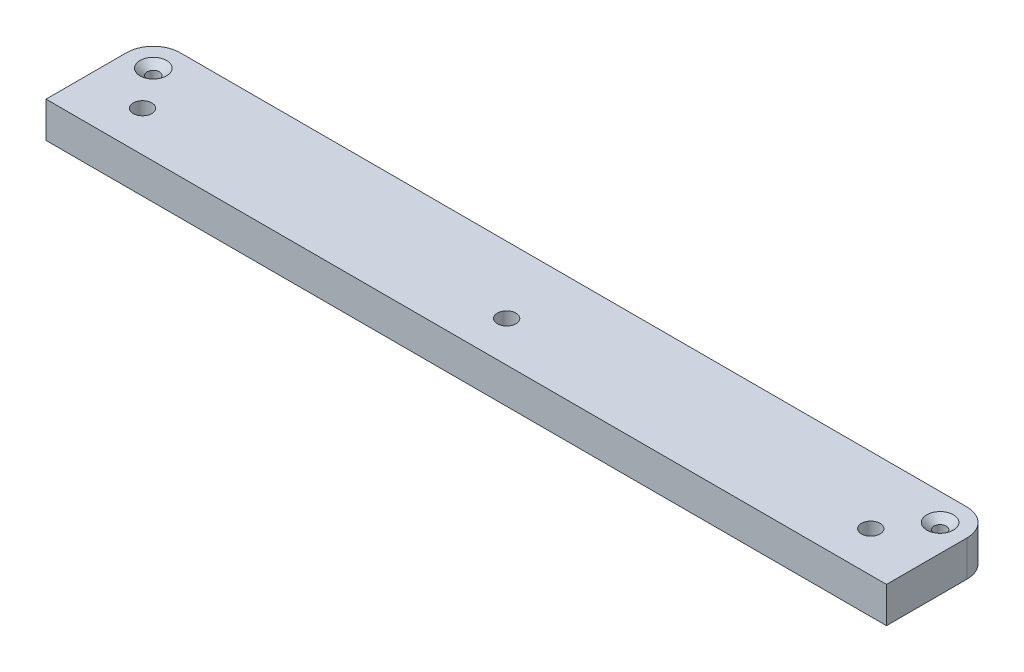
ISO-10303-21;
HEADER;
FILE_DESCRIPTION(('STEP AP214'),'2;1');
FILE_NAME('part.step','',(''),(''),'','','');
FILE_SCHEMA(('AUTOMOTIVE_DESIGN { 1 0 10303 214 1 1 1 1 }'));
ENDSEC;
DATA;
#1=APPLICATION_CONTEXT('core data for automotive mechanical design processes');
#2=APPLICATION_PROTOCOL_DEFINITION('international standard','automotive_design',2000,#1);
#3=PRODUCT_CONTEXT('',#1,'mechanical');
#4=PRODUCT('Part','Part','',(#3));
#5=PRODUCT_RELATED_PRODUCT_CATEGORY('part','',(#4));
#6=PRODUCT_DEFINITION_FORMATION('','',#4);
#7=PRODUCT_DEFINITION_CONTEXT('part definition',#1,'design');
#8=PRODUCT_DEFINITION('design','',#6,#7);
#9=PRODUCT_DEFINITION_SHAPE('','',#8);
#10=(LENGTH_UNIT() NAMED_UNIT(*) SI_UNIT(.MILLI.,.METRE.));
#11=(NAMED_UNIT(*) PLANE_ANGLE_UNIT() SI_UNIT($,.RADIAN.));
#12=(NAMED_UNIT(*) SI_UNIT($,.STERADIAN.) SOLID_ANGLE_UNIT());
#13=UNCERTAINTY_MEASURE_WITH_UNIT(LENGTH_MEASURE(1.E-05),#10,'distance_accuracy_value','');
#14=(GEOMETRIC_REPRESENTATION_CONTEXT(3) GLOBAL_UNCERTAINTY_ASSIGNED_CONTEXT((#13)) GLOBAL_UNIT_ASSIGNED_CONTEXT((#10,
#11,#12)) REPRESENTATION_CONTEXT('',''));
#15=CARTESIAN_POINT('',(0.,0.,0.));
#16=DIRECTION('',(0.,0.,1.));
#17=DIRECTION('',(1.,0.,0.));
#18=AXIS2_PLACEMENT_3D('',#15,#16,#17);
#19=CARTESIAN_POINT('',(278.511,12.7,-14.351));
#20=DIRECTION('',(0.,-1.,0.));
#21=DIRECTION('',(0.,0.,-1.));
#22=AXIS2_PLACEMENT_3D('',#19,#20,#21);
#23=CYLINDRICAL_SURFACE('',#22,1.42239999999999);
#24=CARTESIAN_POINT('',(278.511,4.7625,-14.351));
#25=DIRECTION('',(0.,1.,0.));
#26=DIRECTION('',(0.,0.,1.));
#27=AXIS2_PLACEMENT_3D('',#24,#25,#26);
#28=CIRCLE('',#27,1.42239999999999);
#29=CARTESIAN_POINT('',(278.511,4.7625,-12.9286));
#30=VERTEX_POINT('',#29);
#31=EDGE_CURVE('E137',#30,#30,#28,.T.);
#32=ORIENTED_EDGE('',*,*,#31,.T.);
#33=EDGE_LOOP('',(#32));
#34=FACE_BOUND('',#33,.T.);
#35=CARTESIAN_POINT('',(278.511,2.921,-14.351));
#36=DIRECTION('',(0.,-1.,0.));
#37=DIRECTION('',(0.,0.,-1.));
#38=AXIS2_PLACEMENT_3D('',#35,#36,#37);
#39=CIRCLE('',#38,1.42239999999999);
#40=CARTESIAN_POINT('',(278.511,2.921,-15.7734));
#41=VERTEX_POINT('',#40);
#42=EDGE_CURVE('E149',#41,#41,#39,.F.);
#43=ORIENTED_EDGE('',*,*,#42,.F.);
#44=EDGE_LOOP('',(#43));
#45=FACE_BOUND('',#44,.T.);
#46=ADVANCED_FACE('F33',(#34,#45),#23,.F.);
#47=CARTESIAN_POINT('',(149.225,12.7,-14.351));
#48=DIRECTION('',(0.,-1.,0.));
#49=DIRECTION('',(0.,0.,-1.));
#50=AXIS2_PLACEMENT_3D('',#47,#48,#49);
#51=CYLINDRICAL_SURFACE('',#50,1.42239999999999);
#52=CARTESIAN_POINT('',(149.225,4.7625,-14.351));
#53=DIRECTION('',(0.,1.,0.));
#54=DIRECTION('',(0.,0.,1.));
#55=AXIS2_PLACEMENT_3D('',#52,#53,#54);
#56=CIRCLE('',#55,1.42239999999999);
#57=CARTESIAN_POINT('',(149.225,4.7625,-12.9286));
#58=VERTEX_POINT('',#57);
#59=EDGE_CURVE('E134',#58,#58,#56,.T.);
#60=ORIENTED_EDGE('',*,*,#59,.T.);
#61=EDGE_LOOP('',(#60));
#62=FACE_BOUND('',#61,.T.);
#63=CARTESIAN_POINT('',(149.225,2.921,-14.351));
#64=DIRECTION('',(0.,-1.,0.));
#65=DIRECTION('',(0.,0.,-1.));
#66=AXIS2_PLACEMENT_3D('',#63,#64,#65);
#67=CIRCLE('',#66,1.42239999999999);
#68=CARTESIAN_POINT('',(149.225,2.921,-15.7734));
#69=VERTEX_POINT('',#68);
#70=EDGE_CURVE('E144',#69,#69,#67,.F.);
#71=ORIENTED_EDGE('',*,*,#70,.F.);
#72=EDGE_LOOP('',(#71));
#73=FACE_BOUND('',#72,.T.);
#74=ADVANCED_FACE('F249',(#62,#73),#51,.F.);
#75=CARTESIAN_POINT('',(19.939,12.7,-14.351));
#76=DIRECTION('',(0.,-1.,0.));
#77=DIRECTION('',(0.,0.,-1.));
#78=AXIS2_PLACEMENT_3D('',#75,#76,#77);
#79=CYLINDRICAL_SURFACE('',#78,1.4224);
#80=CARTESIAN_POINT('',(19.939,4.7625,-14.351));
#81=DIRECTION('',(0.,1.,0.));
#82=DIRECTION('',(0.,0.,1.));
#83=AXIS2_PLACEMENT_3D('',#80,#81,#82);
#84=CIRCLE('',#83,1.4224);
#85=CARTESIAN_POINT('',(19.939,4.7625,-12.9286));
#86=VERTEX_POINT('',#85);
#87=EDGE_CURVE('E130',#86,#86,#84,.T.);
#88=ORIENTED_EDGE('',*,*,#87,.T.);
#89=EDGE_LOOP('',(#88));
#90=FACE_BOUND('',#89,.T.);
#91=CARTESIAN_POINT('',(19.939,2.921,-14.351));
#92=DIRECTION('',(0.,-1.,0.));
#93=DIRECTION('',(0.,0.,-1.));
#94=AXIS2_PLACEMENT_3D('',#91,#92,#93);
#95=CIRCLE('',#94,1.4224);
#96=CARTESIAN_POINT('',(19.939,2.921,-15.7734));
#97=VERTEX_POINT('',#96);
#98=EDGE_CURVE('E140',#97,#97,#95,.F.);
#99=ORIENTED_EDGE('',*,*,#98,.F.);
#100=EDGE_LOOP('',(#99));
#101=FACE_BOUND('',#100,.T.);
#102=ADVANCED_FACE('F255',(#90,#101),#79,.F.);
#103=CARTESIAN_POINT('',(0.,12.7,0.));
#104=DIRECTION('',(1.,0.,0.));
#105=DIRECTION('',(0.,0.,-1.));
#106=AXIS2_PLACEMENT_3D('',#103,#104,#105);
#107=PLANE('',#106);
#108=DIRECTION('',(0.,0.,1.));
#109=VECTOR('',#108,1.);
#110=CARTESIAN_POINT('',(0.,12.7,0.));
#111=LINE('',#110,#109);
#112=CARTESIAN_POINT('',(0.,12.7,-28.575));
#113=VERTEX_POINT('',#112);
#114=CARTESIAN_POINT('',(0.,12.7,0.));
#115=VERTEX_POINT('',#114);
#116=EDGE_CURVE('E86',#113,#115,#111,.T.);
#117=ORIENTED_EDGE('',*,*,#116,.F.);
#118=DIRECTION('',(0.,-1.,0.));
#119=VECTOR('',#118,1.);
#120=CARTESIAN_POINT('',(0.,12.7,-28.575));
#121=LINE('',#120,#119);
#122=CARTESIAN_POINT('',(0.,0.,-28.575));
#123=VERTEX_POINT('',#122);
#124=EDGE_CURVE('E127',#113,#123,#121,.T.);
#125=ORIENTED_EDGE('',*,*,#124,.T.);
#126=DIRECTION('',(0.,0.,1.));
#127=VECTOR('',#126,1.);
#128=CARTESIAN_POINT('',(0.,0.,0.));
#129=LINE('',#128,#127);
#130=CARTESIAN_POINT('',(0.,0.,0.));
#131=VERTEX_POINT('',#130);
#132=EDGE_CURVE('E107',#123,#131,#129,.T.);
#133=ORIENTED_EDGE('',*,*,#132,.T.);
#134=DIRECTION('',(0.,-1.,0.));
#135=VECTOR('',#134,1.);
#136=CARTESIAN_POINT('',(0.,12.7,0.));
#137=LINE('',#136,#135);
#138=EDGE_CURVE('E100',#115,#131,#137,.T.);
#139=ORIENTED_EDGE('',*,*,#138,.F.);
#140=EDGE_LOOP('',(#117,#125,#133,#139));
#141=FACE_BOUND('',#140,.T.);
#142=ADVANCED_FACE('F105',(#141),#107,.F.);
#143=CARTESIAN_POINT('',(0.,12.7,0.));
#144=DIRECTION('',(0.,0.,-1.));
#145=DIRECTION('',(-1.,0.,0.));
#146=AXIS2_PLACEMENT_3D('',#143,#144,#145);
#147=PLANE('',#146);
#148=DIRECTION('',(1.,0.,0.));
#149=VECTOR('',#148,1.);
#150=CARTESIAN_POINT('',(0.,0.,0.));
#151=LINE('',#150,#149);
#152=CARTESIAN_POINT('',(298.45,0.,0.));
#153=VERTEX_POINT('',#152);
#154=EDGE_CURVE('E218',#131,#153,#151,.T.);
#155=ORIENTED_EDGE('',*,*,#154,.T.);
#156=DIRECTION('',(0.,-1.,0.));
#157=VECTOR('',#156,1.);
#158=CARTESIAN_POINT('',(298.45,12.7,0.));
#159=LINE('',#158,#157);
#160=CARTESIAN_POINT('',(298.45,12.7,0.));
#161=VERTEX_POINT('',#160);
#162=EDGE_CURVE('E102',#161,#153,#159,.T.);
#163=ORIENTED_EDGE('',*,*,#162,.F.);
#164=DIRECTION('',(1.,0.,0.));
#165=VECTOR('',#164,1.);
#166=CARTESIAN_POINT('',(0.,12.7,0.));
#167=LINE('',#166,#165);
#168=EDGE_CURVE('E89',#115,#161,#167,.T.);
#169=ORIENTED_EDGE('',*,*,#168,.F.);
#170=ORIENTED_EDGE('',*,*,#138,.T.);
#171=EDGE_LOOP('',(#155,#163,#169,#170));
#172=FACE_BOUND('',#171,.T.);
#173=ADVANCED_FACE('F99',(#172),#147,.F.);
#174=CARTESIAN_POINT('',(298.45,12.7,0.));
#175=DIRECTION('',(-1.,0.,0.));
#176=DIRECTION('',(0.,0.,1.));
#177=AXIS2_PLACEMENT_3D('',#174,#175,#176);
#178=PLANE('',#177);
#179=DIRECTION('',(0.,0.,-1.));
#180=VECTOR('',#179,1.);
#181=CARTESIAN_POINT('',(298.45,0.,0.));
#182=LINE('',#181,#180);
#183=CARTESIAN_POINT('',(298.45,0.,-28.575));
#184=VERTEX_POINT('',#183);
#185=EDGE_CURVE('E220',#153,#184,#182,.T.);
#186=ORIENTED_EDGE('',*,*,#185,.T.);
#187=DIRECTION('',(0.,-1.,0.));
#188=VECTOR('',#187,1.);
#189=CARTESIAN_POINT('',(298.45,12.7,-28.575));
#190=LINE('',#189,#188);
#191=CARTESIAN_POINT('',(298.45,12.7,-28.575));
#192=VERTEX_POINT('',#191);
#193=EDGE_CURVE('E56',#184,#192,#190,.F.);
#194=ORIENTED_EDGE('',*,*,#193,.T.);
#195=DIRECTION('',(0.,0.,-1.));
#196=VECTOR('',#195,1.);
#197=CARTESIAN_POINT('',(298.45,12.7,0.));
#198=LINE('',#197,#196);
#199=EDGE_CURVE('E103',#161,#192,#198,.T.);
#200=ORIENTED_EDGE('',*,*,#199,.F.);
#201=ORIENTED_EDGE('',*,*,#162,.T.);
#202=EDGE_LOOP('',(#186,#194,#200,#201));
#203=FACE_BOUND('',#202,.T.);
#204=ADVANCED_FACE('F233',(#203),#178,.F.);
#205=CARTESIAN_POINT('',(0.,12.7,-38.1));
#206=DIRECTION('',(0.,0.,1.));
#207=DIRECTION('',(1.,0.,0.));
#208=AXIS2_PLACEMENT_3D('',#205,#206,#207);
#209=PLANE('',#208);
#210=DIRECTION('',(-1.,0.,0.));
#211=VECTOR('',#210,1.);
#212=CARTESIAN_POINT('',(0.,12.7,-38.1));
#213=LINE('',#212,#211);
#214=CARTESIAN_POINT('',(288.925,12.7,-38.1));
#215=VERTEX_POINT('',#214);
#216=CARTESIAN_POINT('',(9.525,12.7,-38.1));
#217=VERTEX_POINT('',#216);
#218=EDGE_CURVE('E113',#215,#217,#213,.T.);
#219=ORIENTED_EDGE('',*,*,#218,.F.);
#220=DIRECTION('',(0.,-1.,0.));
#221=VECTOR('',#220,1.);
#222=CARTESIAN_POINT('',(288.925,12.7,-38.1));
#223=LINE('',#222,#221);
#224=CARTESIAN_POINT('',(288.925,0.,-38.1));
#225=VERTEX_POINT('',#224);
#226=EDGE_CURVE('E111',#215,#225,#223,.T.);
#227=ORIENTED_EDGE('',*,*,#226,.T.);
#228=DIRECTION('',(-1.,0.,0.));
#229=VECTOR('',#228,1.);
#230=CARTESIAN_POINT('',(0.,0.,-38.1));
#231=LINE('',#230,#229);
#232=CARTESIAN_POINT('',(9.525,0.,-38.1));
#233=VERTEX_POINT('',#232);
#234=EDGE_CURVE('E95',#225,#233,#231,.T.);
#235=ORIENTED_EDGE('',*,*,#234,.T.);
#236=DIRECTION('',(0.,-1.,0.));
#237=VECTOR('',#236,1.);
#238=CARTESIAN_POINT('',(9.525,12.7,-38.1));
#239=LINE('',#238,#237);
#240=EDGE_CURVE('E109',#233,#217,#239,.F.);
#241=ORIENTED_EDGE('',*,*,#240,.T.);
#242=EDGE_LOOP('',(#219,#227,#235,#241));
#243=FACE_BOUND('',#242,.T.);
#244=ADVANCED_FACE('F226',(#243),#209,.F.);
#245=CARTESIAN_POINT('',(0.,12.7,0.));
#246=DIRECTION('',(0.,-1.,0.));
#247=DIRECTION('',(0.,0.,-1.));
#248=AXIS2_PLACEMENT_3D('',#245,#246,#247);
#249=PLANE('',#248);
#250=CARTESIAN_POINT('',(288.925,12.7,-28.575));
#251=DIRECTION('',(0.,-1.,0.));
#252=DIRECTION('',(0.,0.,-1.));
#253=AXIS2_PLACEMENT_3D('',#250,#251,#252);
#254=CIRCLE('',#253,4.72439999999993);
#255=CARTESIAN_POINT('',(288.925,12.7,-33.2993999999999));
#256=VERTEX_POINT('',#255);
#257=EDGE_CURVE('E41',#256,#256,#254,.T.);
#258=ORIENTED_EDGE('',*,*,#257,.T.);
#259=EDGE_LOOP('',(#258));
#260=FACE_BOUND('',#259,.T.);
#261=CARTESIAN_POINT('',(9.525,12.7,-28.575));
#262=DIRECTION('',(0.,-1.,0.));
#263=DIRECTION('',(0.,0.,-1.));
#264=AXIS2_PLACEMENT_3D('',#261,#262,#263);
#265=CIRCLE('',#264,4.72439999999996);
#266=CARTESIAN_POINT('',(9.525,12.7,-33.2993999999999));
#267=VERTEX_POINT('',#266);
#268=EDGE_CURVE('E156',#267,#267,#265,.T.);
#269=ORIENTED_EDGE('',*,*,#268,.T.);
#270=EDGE_LOOP('',(#269));
#271=FACE_BOUND('',#270,.T.);
#272=CARTESIAN_POINT('',(278.511,12.7,-14.351));
#273=DIRECTION('',(0.,1.,0.));
#274=DIRECTION('',(0.,0.,1.));
#275=AXIS2_PLACEMENT_3D('',#272,#273,#274);
#276=CIRCLE('',#275,3.30200000000004);
#277=CARTESIAN_POINT('',(278.511,12.7,-11.049));
#278=VERTEX_POINT('',#277);
#279=EDGE_CURVE('E133',#278,#278,#276,.T.);
#280=ORIENTED_EDGE('',*,*,#279,.F.);
#281=EDGE_LOOP('',(#280));
#282=FACE_BOUND('',#281,.T.);
#283=CARTESIAN_POINT('',(149.225,12.7,-14.351));
#284=DIRECTION('',(0.,1.,0.));
#285=DIRECTION('',(0.,0.,1.));
#286=AXIS2_PLACEMENT_3D('',#283,#284,#285);
#287=CIRCLE('',#286,3.30200000000001);
#288=CARTESIAN_POINT('',(149.225,12.7,-11.049));
#289=VERTEX_POINT('',#288);
#290=EDGE_CURVE('E201',#289,#289,#287,.T.);
#291=ORIENTED_EDGE('',*,*,#290,.F.);
#292=EDGE_LOOP('',(#291));
#293=FACE_BOUND('',#292,.T.);
#294=CARTESIAN_POINT('',(19.939,12.7,-14.351));
#295=DIRECTION('',(0.,1.,0.));
#296=DIRECTION('',(0.,0.,1.));
#297=AXIS2_PLACEMENT_3D('',#294,#295,#296);
#298=CIRCLE('',#297,3.302);
#299=CARTESIAN_POINT('',(19.939,12.7,-11.049));
#300=VERTEX_POINT('',#299);
#301=EDGE_CURVE('E207',#300,#300,#298,.T.);
#302=ORIENTED_EDGE('',*,*,#301,.F.);
#303=EDGE_LOOP('',(#302));
#304=FACE_BOUND('',#303,.T.);
#305=ORIENTED_EDGE('',*,*,#199,.T.);
#306=CARTESIAN_POINT('',(288.925,12.7,-28.575));
#307=DIRECTION('',(0.,-1.,0.));
#308=DIRECTION('',(0.,0.,-1.));
#309=AXIS2_PLACEMENT_3D('',#306,#307,#308);
#310=CIRCLE('',#309,9.525);
#311=EDGE_CURVE('E125',#192,#215,#310,.F.);
#312=ORIENTED_EDGE('',*,*,#311,.T.);
#313=ORIENTED_EDGE('',*,*,#218,.T.);
#314=CARTESIAN_POINT('',(9.525,12.7,-28.575));
#315=DIRECTION('',(0.,-1.,0.));
#316=DIRECTION('',(0.,0.,-1.));
#317=AXIS2_PLACEMENT_3D('',#314,#315,#316);
#318=CIRCLE('',#317,9.525);
#319=EDGE_CURVE('E48',#217,#113,#318,.F.);
#320=ORIENTED_EDGE('',*,*,#319,.T.);
#321=ORIENTED_EDGE('',*,*,#116,.T.);
#322=ORIENTED_EDGE('',*,*,#168,.T.);
#323=EDGE_LOOP('',(#305,#312,#313,#320,#321,#322));
#324=FACE_BOUND('',#323,.T.);
#325=ADVANCED_FACE('F88',(#260,#271,#282,#293,#304,#324),#249,.F.);
#326=CARTESIAN_POINT('',(0.,0.,0.));
#327=DIRECTION('',(0.,-1.,0.));
#328=DIRECTION('',(0.,0.,-1.));
#329=AXIS2_PLACEMENT_3D('',#326,#327,#328);
#330=PLANE('',#329);
#331=CARTESIAN_POINT('',(149.225,0.,-28.575));
#332=DIRECTION('',(0.,1.,0.));
#333=DIRECTION('',(0.,0.,1.));
#334=AXIS2_PLACEMENT_3D('',#331,#332,#333);
#335=CIRCLE('',#334,7.23899999999998);
#336=CARTESIAN_POINT('',(149.225,0.,-21.336));
#337=VERTEX_POINT('',#336);
#338=EDGE_CURVE('E184',#337,#337,#335,.T.);
#339=ORIENTED_EDGE('',*,*,#338,.T.);
#340=EDGE_LOOP('',(#339));
#341=FACE_BOUND('',#340,.T.);
#342=CARTESIAN_POINT('',(9.525,0.,-28.575));
#343=DIRECTION('',(0.,1.,0.));
#344=DIRECTION('',(0.,0.,1.));
#345=AXIS2_PLACEMENT_3D('',#342,#343,#344);
#346=CIRCLE('',#345,2.1844);
#347=CARTESIAN_POINT('',(9.525,0.,-26.3906));
#348=VERTEX_POINT('',#347);
#349=EDGE_CURVE('E179',#348,#348,#346,.T.);
#350=ORIENTED_EDGE('',*,*,#349,.T.);
#351=EDGE_LOOP('',(#350));
#352=FACE_BOUND('',#351,.T.);
#353=CARTESIAN_POINT('',(288.925,0.,-28.575));
#354=DIRECTION('',(0.,1.,0.));
#355=DIRECTION('',(0.,0.,1.));
#356=AXIS2_PLACEMENT_3D('',#353,#354,#355);
#357=CIRCLE('',#356,2.18439999999997);
#358=CARTESIAN_POINT('',(288.925,0.,-26.3906));
#359=VERTEX_POINT('',#358);
#360=EDGE_CURVE('E176',#359,#359,#357,.T.);
#361=ORIENTED_EDGE('',*,*,#360,.T.);
#362=EDGE_LOOP('',(#361));
#363=FACE_BOUND('',#362,.T.);
#364=CARTESIAN_POINT('',(278.511,0.,-14.351));
#365=DIRECTION('',(0.,-1.,0.));
#366=DIRECTION('',(0.,0.,-1.));
#367=AXIS2_PLACEMENT_3D('',#364,#365,#366);
#368=CIRCLE('',#367,2.41299999999999);
#369=CARTESIAN_POINT('',(278.511,0.,-16.764));
#370=VERTEX_POINT('',#369);
#371=EDGE_CURVE('E178',#370,#370,#368,.T.);
#372=ORIENTED_EDGE('',*,*,#371,.F.);
#373=EDGE_LOOP('',(#372));
#374=FACE_BOUND('',#373,.T.);
#375=CARTESIAN_POINT('',(149.225,0.,-14.351));
#376=DIRECTION('',(0.,-1.,0.));
#377=DIRECTION('',(0.,0.,-1.));
#378=AXIS2_PLACEMENT_3D('',#375,#376,#377);
#379=CIRCLE('',#378,2.41299999999999);
#380=CARTESIAN_POINT('',(149.225,0.,-16.764));
#381=VERTEX_POINT('',#380);
#382=EDGE_CURVE('E152',#381,#381,#379,.T.);
#383=ORIENTED_EDGE('',*,*,#382,.F.);
#384=EDGE_LOOP('',(#383));
#385=FACE_BOUND('',#384,.T.);
#386=CARTESIAN_POINT('',(19.939,0.,-14.351));
#387=DIRECTION('',(0.,-1.,0.));
#388=DIRECTION('',(0.,0.,-1.));
#389=AXIS2_PLACEMENT_3D('',#386,#387,#388);
#390=CIRCLE('',#389,2.413);
#391=CARTESIAN_POINT('',(19.939,0.,-16.764));
#392=VERTEX_POINT('',#391);
#393=EDGE_CURVE('E147',#392,#392,#390,.T.);
#394=ORIENTED_EDGE('',*,*,#393,.F.);
#395=EDGE_LOOP('',(#394));
#396=FACE_BOUND('',#395,.T.);
#397=ORIENTED_EDGE('',*,*,#234,.F.);
#398=CARTESIAN_POINT('',(288.925,0.,-28.575));
#399=DIRECTION('',(0.,-1.,0.));
#400=DIRECTION('',(0.,0.,-1.));
#401=AXIS2_PLACEMENT_3D('',#398,#399,#400);
#402=CIRCLE('',#401,9.525);
#403=EDGE_CURVE('E121',#225,#184,#402,.T.);
#404=ORIENTED_EDGE('',*,*,#403,.T.);
#405=ORIENTED_EDGE('',*,*,#185,.F.);
#406=ORIENTED_EDGE('',*,*,#154,.F.);
#407=ORIENTED_EDGE('',*,*,#132,.F.);
#408=CARTESIAN_POINT('',(9.525,0.,-28.575));
#409=DIRECTION('',(0.,-1.,0.));
#410=DIRECTION('',(0.,0.,-1.));
#411=AXIS2_PLACEMENT_3D('',#408,#409,#410);
#412=CIRCLE('',#411,9.525);
#413=EDGE_CURVE('E119',#123,#233,#412,.T.);
#414=ORIENTED_EDGE('',*,*,#413,.T.);
#415=EDGE_LOOP('',(#397,#404,#405,#406,#407,#414));
#416=FACE_BOUND('',#415,.T.);
#417=ADVANCED_FACE('F231',(#341,#352,#363,#374,#385,#396,#416),#330,.T.);
#418=CARTESIAN_POINT('',(288.925,12.7,-28.575));
#419=DIRECTION('',(0.,-1.,0.));
#420=DIRECTION('',(0.,0.,-1.));
#421=AXIS2_PLACEMENT_3D('',#418,#419,#420);
#422=CYLINDRICAL_SURFACE('',#421,9.525);
#423=ORIENTED_EDGE('',*,*,#311,.F.);
#424=ORIENTED_EDGE('',*,*,#193,.F.);
#425=ORIENTED_EDGE('',*,*,#403,.F.);
#426=ORIENTED_EDGE('',*,*,#226,.F.);
#427=EDGE_LOOP('',(#423,#424,#425,#426));
#428=FACE_BOUND('',#427,.T.);
#429=ADVANCED_FACE('F236',(#428),#422,.T.);
#430=CARTESIAN_POINT('',(9.525,12.7,-28.575));
#431=DIRECTION('',(0.,-1.,0.));
#432=DIRECTION('',(0.,0.,-1.));
#433=AXIS2_PLACEMENT_3D('',#430,#431,#432);
#434=CYLINDRICAL_SURFACE('',#433,9.525);
#435=ORIENTED_EDGE('',*,*,#319,.F.);
#436=ORIENTED_EDGE('',*,*,#240,.F.);
#437=ORIENTED_EDGE('',*,*,#413,.F.);
#438=ORIENTED_EDGE('',*,*,#124,.F.);
#439=EDGE_LOOP('',(#435,#436,#437,#438));
#440=FACE_BOUND('',#439,.T.);
#441=ADVANCED_FACE('F230',(#440),#434,.T.);
#442=CARTESIAN_POINT('',(19.939,4.7625,-14.351));
#443=DIRECTION('',(0.,1.,0.));
#444=DIRECTION('',(0.,0.,1.));
#445=AXIS2_PLACEMENT_3D('',#442,#443,#444);
#446=CYLINDRICAL_SURFACE('',#445,3.302);
#447=CARTESIAN_POINT('',(19.939,4.7625,-14.351));
#448=DIRECTION('',(0.,1.,0.));
#449=DIRECTION('',(0.,0.,1.));
#450=AXIS2_PLACEMENT_3D('',#447,#448,#449);
#451=CIRCLE('',#450,3.302);
#452=CARTESIAN_POINT('',(19.939,4.7625,-11.049));
#453=VERTEX_POINT('',#452);
#454=EDGE_CURVE('E210',#453,#453,#451,.T.);
#455=ORIENTED_EDGE('',*,*,#454,.F.);
#456=EDGE_LOOP('',(#455));
#457=FACE_BOUND('',#456,.T.);
#458=ORIENTED_EDGE('',*,*,#301,.T.);
#459=EDGE_LOOP('',(#458));
#460=FACE_BOUND('',#459,.T.);
#461=ADVANCED_FACE('F243',(#457,#460),#446,.F.);
#462=CARTESIAN_POINT('',(19.939,4.7625,-14.351));
#463=DIRECTION('',(0.,1.,0.));
#464=DIRECTION('',(0.,0.,1.));
#465=AXIS2_PLACEMENT_3D('',#462,#463,#464);
#466=PLANE('',#465);
#467=ORIENTED_EDGE('',*,*,#87,.F.);
#468=EDGE_LOOP('',(#467));
#469=FACE_BOUND('',#468,.T.);
#470=ORIENTED_EDGE('',*,*,#454,.T.);
#471=EDGE_LOOP('',(#470));
#472=FACE_BOUND('',#471,.T.);
#473=ADVANCED_FACE('F282',(#469,#472),#466,.T.);
#474=CARTESIAN_POINT('',(149.225,4.7625,-14.351));
#475=DIRECTION('',(0.,1.,0.));
#476=DIRECTION('',(0.,0.,1.));
#477=AXIS2_PLACEMENT_3D('',#474,#475,#476);
#478=CYLINDRICAL_SURFACE('',#477,3.30200000000001);
#479=CARTESIAN_POINT('',(149.225,4.7625,-14.351));
#480=DIRECTION('',(0.,1.,0.));
#481=DIRECTION('',(0.,0.,1.));
#482=AXIS2_PLACEMENT_3D('',#479,#480,#481);
#483=CIRCLE('',#482,3.30200000000001);
#484=CARTESIAN_POINT('',(149.225,4.7625,-11.049));
#485=VERTEX_POINT('',#484);
#486=EDGE_CURVE('E204',#485,#485,#483,.T.);
#487=ORIENTED_EDGE('',*,*,#486,.F.);
#488=EDGE_LOOP('',(#487));
#489=FACE_BOUND('',#488,.T.);
#490=ORIENTED_EDGE('',*,*,#290,.T.);
#491=EDGE_LOOP('',(#490));
#492=FACE_BOUND('',#491,.T.);
#493=ADVANCED_FACE('F278',(#489,#492),#478,.F.);
#494=CARTESIAN_POINT('',(149.225,4.7625,-14.351));
#495=DIRECTION('',(0.,1.,0.));
#496=DIRECTION('',(0.,0.,1.));
#497=AXIS2_PLACEMENT_3D('',#494,#495,#496);
#498=PLANE('',#497);
#499=ORIENTED_EDGE('',*,*,#59,.F.);
#500=EDGE_LOOP('',(#499));
#501=FACE_BOUND('',#500,.T.);
#502=ORIENTED_EDGE('',*,*,#486,.T.);
#503=EDGE_LOOP('',(#502));
#504=FACE_BOUND('',#503,.T.);
#505=ADVANCED_FACE('F274',(#501,#504),#498,.T.);
#506=CARTESIAN_POINT('',(278.511,4.7625,-14.351));
#507=DIRECTION('',(0.,1.,0.));
#508=DIRECTION('',(0.,0.,1.));
#509=AXIS2_PLACEMENT_3D('',#506,#507,#508);
#510=CYLINDRICAL_SURFACE('',#509,3.30200000000004);
#511=CARTESIAN_POINT('',(278.511,4.7625,-14.351));
#512=DIRECTION('',(0.,1.,0.));
#513=DIRECTION('',(0.,0.,1.));
#514=AXIS2_PLACEMENT_3D('',#511,#512,#513);
#515=CIRCLE('',#514,3.30200000000004);
#516=CARTESIAN_POINT('',(278.511,4.7625,-11.049));
#517=VERTEX_POINT('',#516);
#518=EDGE_CURVE('E198',#517,#517,#515,.T.);
#519=ORIENTED_EDGE('',*,*,#518,.F.);
#520=EDGE_LOOP('',(#519));
#521=FACE_BOUND('',#520,.T.);
#522=ORIENTED_EDGE('',*,*,#279,.T.);
#523=EDGE_LOOP('',(#522));
#524=FACE_BOUND('',#523,.T.);
#525=ADVANCED_FACE('F270',(#521,#524),#510,.F.);
#526=CARTESIAN_POINT('',(278.511,4.7625,-14.351));
#527=DIRECTION('',(0.,1.,0.));
#528=DIRECTION('',(0.,0.,1.));
#529=AXIS2_PLACEMENT_3D('',#526,#527,#528);
#530=PLANE('',#529);
#531=ORIENTED_EDGE('',*,*,#31,.F.);
#532=EDGE_LOOP('',(#531));
#533=FACE_BOUND('',#532,.T.);
#534=ORIENTED_EDGE('',*,*,#518,.T.);
#535=EDGE_LOOP('',(#534));
#536=FACE_BOUND('',#535,.T.);
#537=ADVANCED_FACE('F266',(#533,#536),#530,.T.);
#538=CARTESIAN_POINT('',(19.939,2.921,-14.351));
#539=DIRECTION('',(0.,-1.,0.));
#540=DIRECTION('',(0.,0.,-1.));
#541=AXIS2_PLACEMENT_3D('',#538,#539,#540);
#542=PLANE('',#541);
#543=CARTESIAN_POINT('',(19.939,2.921,-14.351));
#544=DIRECTION('',(0.,-1.,0.));
#545=DIRECTION('',(0.,0.,-1.));
#546=AXIS2_PLACEMENT_3D('',#543,#544,#545);
#547=CIRCLE('',#546,2.413);
#548=CARTESIAN_POINT('',(19.939,2.921,-16.764));
#549=VERTEX_POINT('',#548);
#550=EDGE_CURVE('E143',#549,#549,#547,.T.);
#551=ORIENTED_EDGE('',*,*,#550,.T.);
#552=EDGE_LOOP('',(#551));
#553=FACE_BOUND('',#552,.T.);
#554=ORIENTED_EDGE('',*,*,#98,.T.);
#555=EDGE_LOOP('',(#554));
#556=FACE_BOUND('',#555,.T.);
#557=ADVANCED_FACE('F269',(#553,#556),#542,.T.);
#558=CARTESIAN_POINT('',(19.939,2.921,-14.351));
#559=DIRECTION('',(0.,-1.,0.));
#560=DIRECTION('',(0.,0.,-1.));
#561=AXIS2_PLACEMENT_3D('',#558,#559,#560);
#562=CYLINDRICAL_SURFACE('',#561,2.413);
#563=ORIENTED_EDGE('',*,*,#550,.F.);
#564=EDGE_LOOP('',(#563));
#565=FACE_BOUND('',#564,.T.);
#566=ORIENTED_EDGE('',*,*,#393,.T.);
#567=EDGE_LOOP('',(#566));
#568=FACE_BOUND('',#567,.T.);
#569=ADVANCED_FACE('F260',(#565,#568),#562,.F.);
#570=CARTESIAN_POINT('',(149.225,2.921,-14.351));
#571=DIRECTION('',(0.,-1.,0.));
#572=DIRECTION('',(0.,0.,-1.));
#573=AXIS2_PLACEMENT_3D('',#570,#571,#572);
#574=PLANE('',#573);
#575=CARTESIAN_POINT('',(149.225,2.921,-14.351));
#576=DIRECTION('',(0.,-1.,0.));
#577=DIRECTION('',(0.,0.,-1.));
#578=AXIS2_PLACEMENT_3D('',#575,#576,#577);
#579=CIRCLE('',#578,2.41299999999999);
#580=CARTESIAN_POINT('',(149.225,2.921,-16.764));
#581=VERTEX_POINT('',#580);
#582=EDGE_CURVE('E148',#581,#581,#579,.T.);
#583=ORIENTED_EDGE('',*,*,#582,.T.);
#584=EDGE_LOOP('',(#583));
#585=FACE_BOUND('',#584,.T.);
#586=ORIENTED_EDGE('',*,*,#70,.T.);
#587=EDGE_LOOP('',(#586));
#588=FACE_BOUND('',#587,.T.);
#589=ADVANCED_FACE('F367',(#585,#588),#574,.T.);
#590=CARTESIAN_POINT('',(149.225,2.921,-14.351));
#591=DIRECTION('',(0.,-1.,0.));
#592=DIRECTION('',(0.,0.,-1.));
#593=AXIS2_PLACEMENT_3D('',#590,#591,#592);
#594=CYLINDRICAL_SURFACE('',#593,2.41299999999999);
#595=ORIENTED_EDGE('',*,*,#582,.F.);
#596=EDGE_LOOP('',(#595));
#597=FACE_BOUND('',#596,.T.);
#598=ORIENTED_EDGE('',*,*,#382,.T.);
#599=EDGE_LOOP('',(#598));
#600=FACE_BOUND('',#599,.T.);
#601=ADVANCED_FACE('F362',(#597,#600),#594,.F.);
#602=CARTESIAN_POINT('',(278.511,2.921,-14.351));
#603=DIRECTION('',(0.,-1.,0.));
#604=DIRECTION('',(0.,0.,-1.));
#605=AXIS2_PLACEMENT_3D('',#602,#603,#604);
#606=PLANE('',#605);
#607=CARTESIAN_POINT('',(278.511,2.921,-14.351));
#608=DIRECTION('',(0.,-1.,0.));
#609=DIRECTION('',(0.,0.,-1.));
#610=AXIS2_PLACEMENT_3D('',#607,#608,#609);
#611=CIRCLE('',#610,2.41299999999999);
#612=CARTESIAN_POINT('',(278.511,2.921,-16.764));
#613=VERTEX_POINT('',#612);
#614=EDGE_CURVE('E153',#613,#613,#611,.T.);
#615=ORIENTED_EDGE('',*,*,#614,.T.);
#616=EDGE_LOOP('',(#615));
#617=FACE_BOUND('',#616,.T.);
#618=ORIENTED_EDGE('',*,*,#42,.T.);
#619=EDGE_LOOP('',(#618));
#620=FACE_BOUND('',#619,.T.);
#621=ADVANCED_FACE('F359',(#617,#620),#606,.T.);
#622=CARTESIAN_POINT('',(278.511,2.921,-14.351));
#623=DIRECTION('',(0.,-1.,0.));
#624=DIRECTION('',(0.,0.,-1.));
#625=AXIS2_PLACEMENT_3D('',#622,#623,#624);
#626=CYLINDRICAL_SURFACE('',#625,2.41299999999999);
#627=ORIENTED_EDGE('',*,*,#614,.F.);
#628=EDGE_LOOP('',(#627));
#629=FACE_BOUND('',#628,.T.);
#630=ORIENTED_EDGE('',*,*,#371,.T.);
#631=EDGE_LOOP('',(#630));
#632=FACE_BOUND('',#631,.T.);
#633=ADVANCED_FACE('F172',(#629,#632),#626,.F.);
#634=CARTESIAN_POINT('',(288.925,0.,-28.575));
#635=DIRECTION('',(0.,1.,0.));
#636=DIRECTION('',(0.,0.,1.));
#637=AXIS2_PLACEMENT_3D('',#634,#635,#636);
#638=CYLINDRICAL_SURFACE('',#637,2.18439999999997);
#639=CARTESIAN_POINT('',(288.925,10.4920116859468,-28.575));
#640=DIRECTION('',(0.,-1.,0.));
#641=DIRECTION('',(0.,0.,-1.));
#642=AXIS2_PLACEMENT_3D('',#639,#640,#641);
#643=CIRCLE('',#642,2.18439999999997);
#644=CARTESIAN_POINT('',(288.925,10.4920116859468,-30.7594));
#645=VERTEX_POINT('',#644);
#646=EDGE_CURVE('E129',#645,#645,#643,.F.);
#647=ORIENTED_EDGE('',*,*,#646,.T.);
#648=EDGE_LOOP('',(#647));
#649=FACE_BOUND('',#648,.T.);
#650=ORIENTED_EDGE('',*,*,#360,.F.);
#651=EDGE_LOOP('',(#650));
#652=FACE_BOUND('',#651,.T.);
#653=ADVANCED_FACE('F169',(#649,#652),#638,.F.);
#654=CARTESIAN_POINT('',(9.525,0.,-28.575));
#655=DIRECTION('',(0.,1.,0.));
#656=DIRECTION('',(0.,0.,1.));
#657=AXIS2_PLACEMENT_3D('',#654,#655,#656);
#658=CYLINDRICAL_SURFACE('',#657,2.1844);
#659=CARTESIAN_POINT('',(9.525,10.4920116859469,-28.575));
#660=DIRECTION('',(0.,-1.,0.));
#661=DIRECTION('',(0.,0.,-1.));
#662=AXIS2_PLACEMENT_3D('',#659,#660,#661);
#663=CIRCLE('',#662,2.1844);
#664=CARTESIAN_POINT('',(9.525,10.4920116859469,-30.7594));
#665=VERTEX_POINT('',#664);
#666=EDGE_CURVE('E11',#665,#665,#663,.F.);
#667=ORIENTED_EDGE('',*,*,#666,.T.);
#668=EDGE_LOOP('',(#667));
#669=FACE_BOUND('',#668,.T.);
#670=ORIENTED_EDGE('',*,*,#349,.F.);
#671=EDGE_LOOP('',(#670));
#672=FACE_BOUND('',#671,.T.);
#673=ADVANCED_FACE('F166',(#669,#672),#658,.F.);
#674=CARTESIAN_POINT('',(288.925,10.4920116859468,-28.575));
#675=DIRECTION('',(0.,1.,0.));
#676=DIRECTION('',(0.,0.,1.));
#677=AXIS2_PLACEMENT_3D('',#674,#675,#676);
#678=CONICAL_SURFACE('',#677,2.18439999999997,0.855211333477226);
#679=ORIENTED_EDGE('',*,*,#257,.F.);
#680=EDGE_LOOP('',(#679));
#681=FACE_BOUND('',#680,.T.);
#682=ORIENTED_EDGE('',*,*,#646,.F.);
#683=EDGE_LOOP('',(#682));
#684=FACE_BOUND('',#683,.T.);
#685=ADVANCED_FACE('F163',(#681,#684),#678,.F.);
#686=CARTESIAN_POINT('',(9.525,10.4920116859469,-28.575));
#687=DIRECTION('',(0.,1.,0.));
#688=DIRECTION('',(0.,0.,1.));
#689=AXIS2_PLACEMENT_3D('',#686,#687,#688);
#690=CONICAL_SURFACE('',#689,2.1844,0.855211333477232);
#691=ORIENTED_EDGE('',*,*,#268,.F.);
#692=EDGE_LOOP('',(#691));
#693=FACE_BOUND('',#692,.T.);
#694=ORIENTED_EDGE('',*,*,#666,.F.);
#695=EDGE_LOOP('',(#694));
#696=FACE_BOUND('',#695,.T.);
#697=ADVANCED_FACE('F35',(#693,#696),#690,.F.);
#698=CARTESIAN_POINT('',(149.225,0.,-28.575));
#699=DIRECTION('',(0.,1.,0.));
#700=DIRECTION('',(0.,0.,1.));
#701=AXIS2_PLACEMENT_3D('',#698,#699,#700);
#702=CYLINDRICAL_SURFACE('',#701,7.23899999999998);
#703=CARTESIAN_POINT('',(149.225,7.62,-28.575));
#704=DIRECTION('',(0.,1.,0.));
#705=DIRECTION('',(0.,0.,1.));
#706=AXIS2_PLACEMENT_3D('',#703,#704,#705);
#707=CIRCLE('',#706,7.23899999999998);
#708=CARTESIAN_POINT('',(149.225,7.62,-21.336));
#709=VERTEX_POINT('',#708);
#710=EDGE_CURVE('E527',#709,#709,#707,.T.);
#711=CARTESIAN_POINT('',(149.225,0.,-21.336));
#712=CARTESIAN_POINT('',(149.225,0.0793749999999998,-21.336));
#713=CARTESIAN_POINT('',(149.225,0.15875,-21.336));
#714=CARTESIAN_POINT('',(149.225,0.3175,-21.336));
#715=CARTESIAN_POINT('',(149.225,0.396875,-21.336));
#716=CARTESIAN_POINT('',(149.225,0.555625,-21.336));
#717=CARTESIAN_POINT('',(149.225,0.635,-21.336));
#718=CARTESIAN_POINT('',(149.225,0.79375,-21.336));
#719=CARTESIAN_POINT('',(149.225,0.873125,-21.336));
#720=CARTESIAN_POINT('',(149.225,1.031875,-21.336));
#721=CARTESIAN_POINT('',(149.225,1.11125,-21.336));
#722=CARTESIAN_POINT('',(149.225,1.27,-21.336));
#723=CARTESIAN_POINT('',(149.225,1.349375,-21.336));
#724=CARTESIAN_POINT('',(149.225,1.508125,-21.336));
#725=CARTESIAN_POINT('',(149.225,1.5875,-21.336));
#726=CARTESIAN_POINT('',(149.225,1.74625,-21.336));
#727=CARTESIAN_POINT('',(149.225,1.825625,-21.336));
#728=CARTESIAN_POINT('',(149.225,1.984375,-21.336));
#729=CARTESIAN_POINT('',(149.225,2.06375,-21.336));
#730=CARTESIAN_POINT('',(149.225,2.2225,-21.336));
#731=CARTESIAN_POINT('',(149.225,2.301875,-21.336));
#732=CARTESIAN_POINT('',(149.225,2.460625,-21.336));
#733=CARTESIAN_POINT('',(149.225,2.54,-21.336));
#734=CARTESIAN_POINT('',(149.225,2.69875,-21.336));
#735=CARTESIAN_POINT('',(149.225,2.778125,-21.336));
#736=CARTESIAN_POINT('',(149.225,2.936875,-21.336));
#737=CARTESIAN_POINT('',(149.225,3.01625,-21.336));
#738=CARTESIAN_POINT('',(149.225,3.175,-21.336));
#739=CARTESIAN_POINT('',(149.225,3.254375,-21.336));
#740=CARTESIAN_POINT('',(149.225,3.413125,-21.336));
#741=CARTESIAN_POINT('',(149.225,3.4925,-21.336));
#742=CARTESIAN_POINT('',(149.225,3.65125,-21.336));
#743=CARTESIAN_POINT('',(149.225,3.730625,-21.336));
#744=CARTESIAN_POINT('',(149.225,3.889375,-21.336));
#745=CARTESIAN_POINT('',(149.225,3.96875,-21.336));
#746=CARTESIAN_POINT('',(149.225,4.1275,-21.336));
#747=CARTESIAN_POINT('',(149.225,4.206875,-21.336));
#748=CARTESIAN_POINT('',(149.225,4.365625,-21.336));
#749=CARTESIAN_POINT('',(149.225,4.445,-21.336));
#750=CARTESIAN_POINT('',(149.225,4.60375,-21.336));
#751=CARTESIAN_POINT('',(149.225,4.683125,-21.336));
#752=CARTESIAN_POINT('',(149.225,4.841875,-21.336));
#753=CARTESIAN_POINT('',(149.225,4.92125,-21.336));
#754=CARTESIAN_POINT('',(149.225,5.08,-21.336));
#755=CARTESIAN_POINT('',(149.225,5.159375,-21.336));
#756=CARTESIAN_POINT('',(149.225,5.318125,-21.336));
#757=CARTESIAN_POINT('',(149.225,5.3975,-21.336));
#758=CARTESIAN_POINT('',(149.225,5.55625,-21.336));
#759=CARTESIAN_POINT('',(149.225,5.635625,-21.336));
#760=CARTESIAN_POINT('',(149.225,5.794375,-21.336));
#761=CARTESIAN_POINT('',(149.225,5.87375,-21.336));
#762=CARTESIAN_POINT('',(149.225,6.0325,-21.336));
#763=CARTESIAN_POINT('',(149.225,6.111875,-21.336));
#764=CARTESIAN_POINT('',(149.225,6.270625,-21.336));
#765=CARTESIAN_POINT('',(149.225,6.35,-21.336));
#766=CARTESIAN_POINT('',(149.225,6.50875,-21.336));
#767=CARTESIAN_POINT('',(149.225,6.588125,-21.336));
#768=CARTESIAN_POINT('',(149.225,6.746875,-21.336));
#769=CARTESIAN_POINT('',(149.225,6.82625,-21.336));
#770=CARTESIAN_POINT('',(149.225,6.985,-21.336));
#771=CARTESIAN_POINT('',(149.225,7.064375,-21.336));
#772=CARTESIAN_POINT('',(149.225,7.223125,-21.336));
#773=CARTESIAN_POINT('',(149.225,7.3025,-21.336));
#774=CARTESIAN_POINT('',(149.225,7.46125,-21.336));
#775=CARTESIAN_POINT('',(149.225,7.540625,-21.336));
#776=CARTESIAN_POINT('',(149.225,7.62,-21.336));
#777=B_SPLINE_CURVE_WITH_KNOTS('',3,(#711,#712,#713,#714,#715,#716,#717,#718,#719,#720,#721,
#722,#723,#724,#725,#726,#727,#728,#729,#730,#731,#732,#733,#734,#735,#736,#737,#738,#739,#740,
#741,#742,#743,#744,#745,#746,#747,#748,#749,#750,#751,#752,#753,#754,#755,#756,#757,#758,#759,
#760,#761,#762,#763,#764,#765,#766,#767,#768,#769,#770,#771,#772,#773,#774,#775,#776),
.UNSPECIFIED.,.F.,.F.,(4,2,2,2,2,2,2,2,2,2,2,2,2,2,2,2,2,2,2,2,2,2,2,2,2,2,2,2,2,2,2,2,4),(0.,
0.238125,0.47625,0.714375,0.9525,1.190625,1.42875,1.666875,1.905,2.143125,2.38125,2.619375,
2.8575,3.095625,3.33375,3.571875,3.81,4.048125,4.28625,4.524375,4.7625,5.000625,5.23875,
5.476875,5.715,5.953125,6.19125,6.429375,6.6675,6.905625,7.14375,7.381875,7.62),.UNSPECIFIED.);
#778=EDGE_CURVE('BSEAM335',#337,#709,#777,.T.);
#779=ORIENTED_EDGE('',*,*,#338,.F.);
#780=ORIENTED_EDGE('',*,*,#710,.T.);
#781=ORIENTED_EDGE('',*,*,#778,.T.);
#782=ORIENTED_EDGE('',*,*,#778,.F.);
#783=EDGE_LOOP('',(#779,#781,#780,#782));
#784=FACE_BOUND('',#783,.T.);
#785=ADVANCED_FACE('F335',(#784),#702,.F.);
#786=CARTESIAN_POINT('',(149.225,7.62,-28.575));
#787=DIRECTION('',(0.,1.,0.));
#788=DIRECTION('',(0.,0.,1.));
#789=AXIS2_PLACEMENT_3D('',#786,#787,#788);
#790=PLANE('',#789);
#791=ORIENTED_EDGE('',*,*,#710,.F.);
#792=EDGE_LOOP('',(#791));
#793=FACE_BOUND('',#792,.T.);
#794=ADVANCED_FACE('F340',(#793),#790,.F.);
#795=CLOSED_SHELL('',(#46,#74,#102,#142,#173,#204,#244,#325,#417,#429,#441,#461,#473,#493,#505,
#525,#537,#557,#569,#589,#601,#621,#633,#653,#673,#685,#697,#785,#794));
#796=MANIFOLD_SOLID_BREP('B2',#795);
#797=ADVANCED_BREP_SHAPE_REPRESENTATION('',(#18,#796),#14);
#798=SHAPE_DEFINITION_REPRESENTATION(#9,#797);
ENDSEC;
END-ISO-10303-21;
